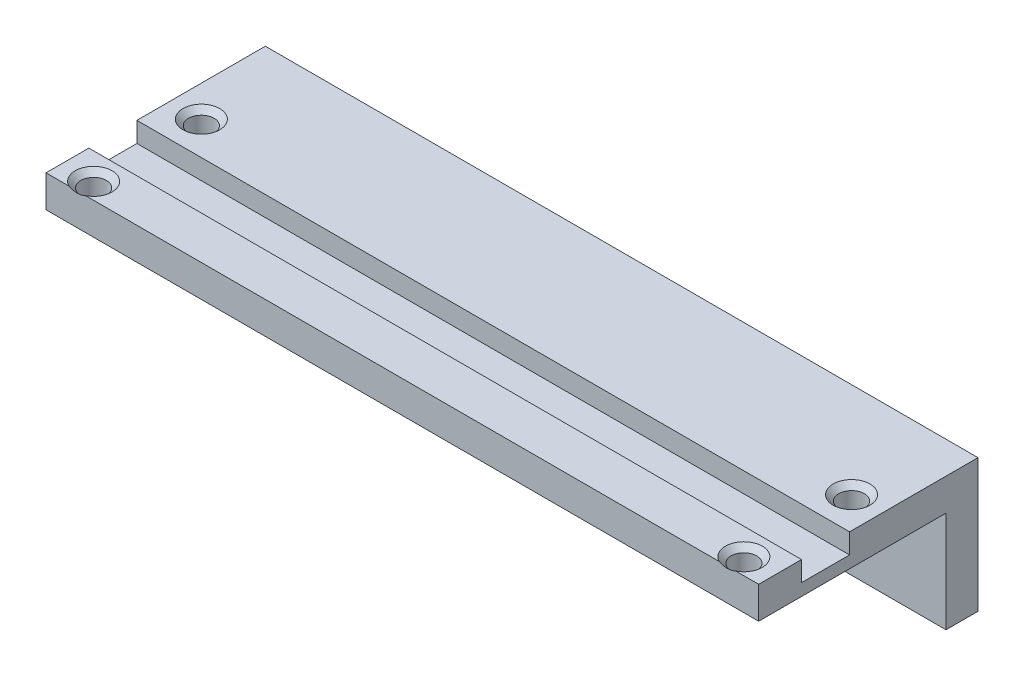
ISO-10303-21;
HEADER;
FILE_DESCRIPTION(('STEP AP214'),'2;1');
FILE_NAME('part.step','',(''),(''),'','','');
FILE_SCHEMA(('AUTOMOTIVE_DESIGN { 1 0 10303 214 1 1 1 1 }'));
ENDSEC;
DATA;
#1=APPLICATION_CONTEXT('core data for automotive mechanical design processes');
#2=APPLICATION_PROTOCOL_DEFINITION('international standard','automotive_design',2000,#1);
#3=PRODUCT_CONTEXT('',#1,'mechanical');
#4=PRODUCT('Part','Part','',(#3));
#5=PRODUCT_RELATED_PRODUCT_CATEGORY('part','',(#4));
#6=PRODUCT_DEFINITION_FORMATION('','',#4);
#7=PRODUCT_DEFINITION_CONTEXT('part definition',#1,'design');
#8=PRODUCT_DEFINITION('design','',#6,#7);
#9=PRODUCT_DEFINITION_SHAPE('','',#8);
#10=(LENGTH_UNIT() NAMED_UNIT(*) SI_UNIT(.MILLI.,.METRE.));
#11=(NAMED_UNIT(*) PLANE_ANGLE_UNIT() SI_UNIT($,.RADIAN.));
#12=(NAMED_UNIT(*) SI_UNIT($,.STERADIAN.) SOLID_ANGLE_UNIT());
#13=UNCERTAINTY_MEASURE_WITH_UNIT(LENGTH_MEASURE(1.E-05),#10,'distance_accuracy_value','');
#14=(GEOMETRIC_REPRESENTATION_CONTEXT(3) GLOBAL_UNCERTAINTY_ASSIGNED_CONTEXT((#13)) GLOBAL_UNIT_ASSIGNED_CONTEXT((#10,
#11,#12)) REPRESENTATION_CONTEXT('',''));
#15=CARTESIAN_POINT('',(0.,0.,0.));
#16=DIRECTION('',(0.,0.,1.));
#17=DIRECTION('',(1.,0.,0.));
#18=AXIS2_PLACEMENT_3D('',#15,#16,#17);
#19=CARTESIAN_POINT('',(0.,0.,0.));
#20=DIRECTION('',(0.,1.,0.));
#21=DIRECTION('',(0.,0.,1.));
#22=AXIS2_PLACEMENT_3D('',#19,#20,#21);
#23=PLANE('',#22);
#24=CARTESIAN_POINT('',(-40.6,0.,9.95));
#25=DIRECTION('',(0.,1.,0.));
#26=DIRECTION('',(0.,0.,1.));
#27=AXIS2_PLACEMENT_3D('',#24,#25,#26);
#28=CIRCLE('',#27,1.6);
#29=CARTESIAN_POINT('',(-40.6,0.,11.55));
#30=VERTEX_POINT('',#29);
#31=EDGE_CURVE('E203',#30,#30,#28,.T.);
#32=ORIENTED_EDGE('',*,*,#31,.T.);
#33=EDGE_LOOP('',(#32));
#34=FACE_BOUND('',#33,.T.);
#35=CARTESIAN_POINT('',(40.6,0.,-3.5));
#36=DIRECTION('',(0.,1.,0.));
#37=DIRECTION('',(0.,0.,1.));
#38=AXIS2_PLACEMENT_3D('',#35,#36,#37);
#39=CIRCLE('',#38,1.6);
#40=CARTESIAN_POINT('',(40.6,0.,-1.9));
#41=VERTEX_POINT('',#40);
#42=EDGE_CURVE('E191',#41,#41,#39,.T.);
#43=ORIENTED_EDGE('',*,*,#42,.T.);
#44=EDGE_LOOP('',(#43));
#45=FACE_BOUND('',#44,.T.);
#46=CARTESIAN_POINT('',(-40.6,0.,-3.5));
#47=DIRECTION('',(0.,1.,0.));
#48=DIRECTION('',(0.,0.,1.));
#49=AXIS2_PLACEMENT_3D('',#46,#47,#48);
#50=CIRCLE('',#49,1.6);
#51=CARTESIAN_POINT('',(-40.6,0.,-1.9));
#52=VERTEX_POINT('',#51);
#53=EDGE_CURVE('E199',#52,#52,#50,.T.);
#54=ORIENTED_EDGE('',*,*,#53,.T.);
#55=EDGE_LOOP('',(#54));
#56=FACE_BOUND('',#55,.T.);
#57=CARTESIAN_POINT('',(40.6,0.,9.95));
#58=DIRECTION('',(0.,1.,0.));
#59=DIRECTION('',(0.,0.,1.));
#60=AXIS2_PLACEMENT_3D('',#57,#58,#59);
#61=CIRCLE('',#60,1.6);
#62=CARTESIAN_POINT('',(40.6,0.,11.55));
#63=VERTEX_POINT('',#62);
#64=EDGE_CURVE('E200',#63,#63,#61,.T.);
#65=ORIENTED_EDGE('',*,*,#64,.T.);
#66=EDGE_LOOP('',(#65));
#67=FACE_BOUND('',#66,.T.);
#68=DIRECTION('',(-1.,0.,0.));
#69=VECTOR('',#68,1.);
#70=CARTESIAN_POINT('',(-44.5,0.,-11.39));
#71=LINE('',#70,#69);
#72=CARTESIAN_POINT('',(44.5,0.,-11.39));
#73=VERTEX_POINT('',#72);
#74=CARTESIAN_POINT('',(-44.5,0.,-11.39));
#75=VERTEX_POINT('',#74);
#76=EDGE_CURVE('E58',#73,#75,#71,.T.);
#77=ORIENTED_EDGE('',*,*,#76,.F.);
#78=DIRECTION('',(0.,0.,-1.));
#79=VECTOR('',#78,1.);
#80=CARTESIAN_POINT('',(44.5,0.,-12.));
#81=LINE('',#80,#79);
#82=CARTESIAN_POINT('',(44.5,0.,12.));
#83=VERTEX_POINT('',#82);
#84=EDGE_CURVE('E208',#83,#73,#81,.T.);
#85=ORIENTED_EDGE('',*,*,#84,.F.);
#86=DIRECTION('',(1.,0.,0.));
#87=VECTOR('',#86,1.);
#88=CARTESIAN_POINT('',(-44.5,0.,12.));
#89=LINE('',#88,#87);
#90=CARTESIAN_POINT('',(-44.5,0.,12.));
#91=VERTEX_POINT('',#90);
#92=EDGE_CURVE('E224',#91,#83,#89,.T.);
#93=ORIENTED_EDGE('',*,*,#92,.F.);
#94=DIRECTION('',(0.,0.,1.));
#95=VECTOR('',#94,1.);
#96=CARTESIAN_POINT('',(-44.5,0.,-12.));
#97=LINE('',#96,#95);
#98=EDGE_CURVE('E222',#75,#91,#97,.T.);
#99=ORIENTED_EDGE('',*,*,#98,.F.);
#100=EDGE_LOOP('',(#77,#85,#93,#99));
#101=FACE_BOUND('',#100,.T.);
#102=ADVANCED_FACE('F41',(#34,#45,#56,#67,#101),#23,.F.);
#103=CARTESIAN_POINT('',(0.,4.,0.));
#104=DIRECTION('',(0.,1.,0.));
#105=DIRECTION('',(0.,0.,1.));
#106=AXIS2_PLACEMENT_3D('',#103,#104,#105);
#107=PLANE('',#106);
#108=CARTESIAN_POINT('',(-40.6,4.,-3.5));
#109=DIRECTION('',(0.,1.,0.));
#110=DIRECTION('',(0.,0.,1.));
#111=AXIS2_PLACEMENT_3D('',#108,#109,#110);
#112=CIRCLE('',#111,2.30000000000001);
#113=CARTESIAN_POINT('',(-40.6,4.,-1.19999999999999));
#114=VERTEX_POINT('',#113);
#115=EDGE_CURVE('E240',#114,#114,#112,.F.);
#116=ORIENTED_EDGE('',*,*,#115,.T.);
#117=EDGE_LOOP('',(#116));
#118=FACE_BOUND('',#117,.T.);
#119=CARTESIAN_POINT('',(40.6,4.,-3.5));
#120=DIRECTION('',(0.,1.,0.));
#121=DIRECTION('',(0.,0.,1.));
#122=AXIS2_PLACEMENT_3D('',#119,#120,#121);
#123=CIRCLE('',#122,2.30000000000001);
#124=CARTESIAN_POINT('',(40.6,4.,-1.19999999999999));
#125=VERTEX_POINT('',#124);
#126=EDGE_CURVE('E237',#125,#125,#123,.F.);
#127=ORIENTED_EDGE('',*,*,#126,.T.);
#128=EDGE_LOOP('',(#127));
#129=FACE_BOUND('',#128,.T.);
#130=DIRECTION('',(0.,0.,1.));
#131=VECTOR('',#130,1.);
#132=CARTESIAN_POINT('',(-44.5,4.,-12.));
#133=LINE('',#132,#131);
#134=CARTESIAN_POINT('',(-44.5,4.,-15.39));
#135=VERTEX_POINT('',#134);
#136=CARTESIAN_POINT('',(-44.5,4.,0.65));
#137=VERTEX_POINT('',#136);
#138=EDGE_CURVE('E142',#135,#137,#133,.T.);
#139=ORIENTED_EDGE('',*,*,#138,.T.);
#140=DIRECTION('',(1.,0.,0.));
#141=VECTOR('',#140,1.);
#142=CARTESIAN_POINT('',(-44.5,4.,0.65));
#143=LINE('',#142,#141);
#144=CARTESIAN_POINT('',(44.5,4.,0.650000000000001));
#145=VERTEX_POINT('',#144);
#146=EDGE_CURVE('E178',#137,#145,#143,.T.);
#147=ORIENTED_EDGE('',*,*,#146,.T.);
#148=DIRECTION('',(0.,0.,-1.));
#149=VECTOR('',#148,1.);
#150=CARTESIAN_POINT('',(44.5,4.,-12.));
#151=LINE('',#150,#149);
#152=CARTESIAN_POINT('',(44.5,4.,-15.39));
#153=VERTEX_POINT('',#152);
#154=EDGE_CURVE('E213',#145,#153,#151,.T.);
#155=ORIENTED_EDGE('',*,*,#154,.T.);
#156=DIRECTION('',(1.,0.,0.));
#157=VECTOR('',#156,1.);
#158=CARTESIAN_POINT('',(44.5,4.,-15.39));
#159=LINE('',#158,#157);
#160=EDGE_CURVE('E146',#135,#153,#159,.T.);
#161=ORIENTED_EDGE('',*,*,#160,.F.);
#162=EDGE_LOOP('',(#139,#147,#155,#161));
#163=FACE_BOUND('',#162,.T.);
#164=ADVANCED_FACE('F273',(#118,#129,#163),#107,.T.);
#165=CARTESIAN_POINT('',(44.5,4.,-12.));
#166=DIRECTION('',(-1.,0.,0.));
#167=DIRECTION('',(0.,0.,1.));
#168=AXIS2_PLACEMENT_3D('',#165,#166,#167);
#169=PLANE('',#168);
#170=DIRECTION('',(0.,0.,1.));
#171=VECTOR('',#170,1.);
#172=CARTESIAN_POINT('',(44.5,1.5,0.65));
#173=LINE('',#172,#171);
#174=CARTESIAN_POINT('',(44.5,1.5,0.65));
#175=VERTEX_POINT('',#174);
#176=CARTESIAN_POINT('',(44.5,1.5,6.65));
#177=VERTEX_POINT('',#176);
#178=EDGE_CURVE('E177',#175,#177,#173,.T.);
#179=ORIENTED_EDGE('',*,*,#178,.T.);
#180=DIRECTION('',(0.,1.,0.));
#181=VECTOR('',#180,1.);
#182=CARTESIAN_POINT('',(44.5,1.5,6.65));
#183=LINE('',#182,#181);
#184=CARTESIAN_POINT('',(44.5,4.,6.65));
#185=VERTEX_POINT('',#184);
#186=EDGE_CURVE('E186',#177,#185,#183,.T.);
#187=ORIENTED_EDGE('',*,*,#186,.T.);
#188=CARTESIAN_POINT('',(44.5,4.,12.));
#189=VERTEX_POINT('',#188);
#190=EDGE_CURVE('E209',#189,#185,#151,.T.);
#191=ORIENTED_EDGE('',*,*,#190,.F.);
#192=DIRECTION('',(0.,-1.,0.));
#193=VECTOR('',#192,1.);
#194=CARTESIAN_POINT('',(44.5,4.,12.));
#195=LINE('',#194,#193);
#196=EDGE_CURVE('E219',#189,#83,#195,.T.);
#197=ORIENTED_EDGE('',*,*,#196,.T.);
#198=ORIENTED_EDGE('',*,*,#84,.T.);
#199=DIRECTION('',(0.,1.,0.));
#200=VECTOR('',#199,1.);
#201=CARTESIAN_POINT('',(44.5,-12.62,-11.39));
#202=LINE('',#201,#200);
#203=CARTESIAN_POINT('',(44.5,-12.62,-11.39));
#204=VERTEX_POINT('',#203);
#205=EDGE_CURVE('E168',#204,#73,#202,.T.);
#206=ORIENTED_EDGE('',*,*,#205,.F.);
#207=DIRECTION('',(0.,0.,1.));
#208=VECTOR('',#207,1.);
#209=CARTESIAN_POINT('',(44.5,-12.62,-15.39));
#210=LINE('',#209,#208);
#211=CARTESIAN_POINT('',(44.5,-12.62,-15.39));
#212=VERTEX_POINT('',#211);
#213=EDGE_CURVE('E155',#212,#204,#210,.T.);
#214=ORIENTED_EDGE('',*,*,#213,.F.);
#215=DIRECTION('',(0.,-1.,0.));
#216=VECTOR('',#215,1.);
#217=CARTESIAN_POINT('',(44.5,4.,-15.39));
#218=LINE('',#217,#216);
#219=EDGE_CURVE('E147',#153,#212,#218,.T.);
#220=ORIENTED_EDGE('',*,*,#219,.F.);
#221=ORIENTED_EDGE('',*,*,#154,.F.);
#222=DIRECTION('',(0.,1.,0.));
#223=VECTOR('',#222,1.);
#224=CARTESIAN_POINT('',(44.5,1.5,0.65));
#225=LINE('',#224,#223);
#226=EDGE_CURVE('E66',#175,#145,#225,.T.);
#227=ORIENTED_EDGE('',*,*,#226,.F.);
#228=EDGE_LOOP('',(#179,#187,#191,#197,#198,#206,#214,#220,#221,#227));
#229=FACE_BOUND('',#228,.T.);
#230=ADVANCED_FACE('F271',(#229),#169,.F.);
#231=CARTESIAN_POINT('',(-44.5,4.,-12.));
#232=DIRECTION('',(1.,0.,0.));
#233=DIRECTION('',(0.,0.,-1.));
#234=AXIS2_PLACEMENT_3D('',#231,#232,#233);
#235=PLANE('',#234);
#236=CARTESIAN_POINT('',(-44.5,4.,6.65));
#237=VERTEX_POINT('',#236);
#238=CARTESIAN_POINT('',(-44.5,4.,12.));
#239=VERTEX_POINT('',#238);
#240=EDGE_CURVE('E212',#237,#239,#133,.T.);
#241=ORIENTED_EDGE('',*,*,#240,.F.);
#242=DIRECTION('',(0.,1.,0.));
#243=VECTOR('',#242,1.);
#244=CARTESIAN_POINT('',(-44.5,1.5,6.65));
#245=LINE('',#244,#243);
#246=CARTESIAN_POINT('',(-44.5,1.5,6.65));
#247=VERTEX_POINT('',#246);
#248=EDGE_CURVE('E189',#247,#237,#245,.T.);
#249=ORIENTED_EDGE('',*,*,#248,.F.);
#250=DIRECTION('',(0.,0.,1.));
#251=VECTOR('',#250,1.);
#252=CARTESIAN_POINT('',(-44.5,1.5,0.65));
#253=LINE('',#252,#251);
#254=CARTESIAN_POINT('',(-44.5,1.5,0.65));
#255=VERTEX_POINT('',#254);
#256=EDGE_CURVE('E183',#255,#247,#253,.T.);
#257=ORIENTED_EDGE('',*,*,#256,.F.);
#258=DIRECTION('',(0.,1.,0.));
#259=VECTOR('',#258,1.);
#260=CARTESIAN_POINT('',(-44.5,1.5,0.65));
#261=LINE('',#260,#259);
#262=EDGE_CURVE('E192',#255,#137,#261,.T.);
#263=ORIENTED_EDGE('',*,*,#262,.T.);
#264=ORIENTED_EDGE('',*,*,#138,.F.);
#265=DIRECTION('',(0.,1.,0.));
#266=VECTOR('',#265,1.);
#267=CARTESIAN_POINT('',(-44.5,4.,-15.39));
#268=LINE('',#267,#266);
#269=CARTESIAN_POINT('',(-44.5,-12.62,-15.39));
#270=VERTEX_POINT('',#269);
#271=EDGE_CURVE('E133',#270,#135,#268,.T.);
#272=ORIENTED_EDGE('',*,*,#271,.F.);
#273=DIRECTION('',(0.,0.,-1.));
#274=VECTOR('',#273,1.);
#275=CARTESIAN_POINT('',(-44.5,-12.62,-15.39));
#276=LINE('',#275,#274);
#277=CARTESIAN_POINT('',(-44.5,-12.62,-11.39));
#278=VERTEX_POINT('',#277);
#279=EDGE_CURVE('E139',#278,#270,#276,.T.);
#280=ORIENTED_EDGE('',*,*,#279,.F.);
#281=DIRECTION('',(0.,1.,0.));
#282=VECTOR('',#281,1.);
#283=CARTESIAN_POINT('',(-44.5,-12.62,-11.39));
#284=LINE('',#283,#282);
#285=EDGE_CURVE('E165',#278,#75,#284,.T.);
#286=ORIENTED_EDGE('',*,*,#285,.T.);
#287=ORIENTED_EDGE('',*,*,#98,.T.);
#288=DIRECTION('',(0.,-1.,0.));
#289=VECTOR('',#288,1.);
#290=CARTESIAN_POINT('',(-44.5,4.,12.));
#291=LINE('',#290,#289);
#292=EDGE_CURVE('E228',#239,#91,#291,.T.);
#293=ORIENTED_EDGE('',*,*,#292,.F.);
#294=EDGE_LOOP('',(#241,#249,#257,#263,#264,#272,#280,#286,#287,#293));
#295=FACE_BOUND('',#294,.T.);
#296=ADVANCED_FACE('F136',(#295),#235,.F.);
#297=CARTESIAN_POINT('',(-44.5,4.,12.));
#298=DIRECTION('',(0.,0.,-1.));
#299=DIRECTION('',(-1.,0.,0.));
#300=AXIS2_PLACEMENT_3D('',#297,#298,#299);
#301=PLANE('',#300);
#302=DIRECTION('',(1.,0.,0.));
#303=VECTOR('',#302,1.);
#304=CARTESIAN_POINT('',(-44.5,4.,12.));
#305=LINE('',#304,#303);
#306=CARTESIAN_POINT('',(-39.5571673192693,4.,12.));
#307=VERTEX_POINT('',#306);
#308=CARTESIAN_POINT('',(39.5571673192693,4.,12.));
#309=VERTEX_POINT('',#308);
#310=EDGE_CURVE('E220',#307,#309,#305,.T.);
#311=ORIENTED_EDGE('',*,*,#310,.F.);
#312=CARTESIAN_POINT('',(-39.5571673192693,4.,12.));
#313=CARTESIAN_POINT('',(-39.6309334262844,3.96656421638273,12.));
#314=CARTESIAN_POINT('',(-39.7058506333684,3.93540373764194,12.));
#315=CARTESIAN_POINT('',(-39.8581858002776,3.87893388207506,12.));
#316=CARTESIAN_POINT('',(-39.9356126452506,3.85364866798946,12.));
#317=CARTESIAN_POINT('',(-40.0915868475527,3.81079265360189,12.));
#318=CARTESIAN_POINT('',(-40.170108112697,3.79312940213403,12.));
#319=CARTESIAN_POINT('',(-40.3285056036563,3.76643099040455,12.));
#320=CARTESIAN_POINT('',(-40.4083793515014,3.75738149064123,12.));
#321=CARTESIAN_POINT('',(-40.5626446604585,3.74900310805638,12.));
#322=CARTESIAN_POINT('',(-40.636999228979,3.74899754413919,12.));
#323=CARTESIAN_POINT('',(-40.7853039115734,3.75702470166128,12.));
#324=CARTESIAN_POINT('',(-40.8592537936944,3.76506162854273,12.));
#325=CARTESIAN_POINT('',(-41.0059345151389,3.78854830585543,12.));
#326=CARTESIAN_POINT('',(-41.0786654240532,3.80399763161277,12.));
#327=CARTESIAN_POINT('',(-41.2224713971537,3.84129414790967,12.));
#328=CARTESIAN_POINT('',(-41.2935458139193,3.86314379612831,12.));
#329=CARTESIAN_POINT('',(-41.4111372203203,3.90419206241791,12.));
#330=CARTESIAN_POINT('',(-41.4581642475137,3.92196371531172,12.));
#331=CARTESIAN_POINT('',(-41.5512063229103,3.95953400303479,12.));
#332=CARTESIAN_POINT('',(-41.5972244138004,3.97932508147157,12.));
#333=CARTESIAN_POINT('',(-41.6428326807308,3.99999999999981,12.));
#334=B_SPLINE_CURVE_WITH_KNOTS('',3,(#312,#313,#314,#315,#316,#317,#318,#319,#320,#321,#322,
#323,#324,#325,#326,#327,#328,#329,#330,#331,#332,#333),.UNSPECIFIED.,.F.,.F.,(4,2,2,2,2,2,2,2,
2,2,4),(0.,0.243096510579763,0.487175756429054,0.728204983271677,0.96883225806452,
1.19145453671029,1.41419328606331,1.63691927570916,1.85973090294407,2.01050258375421,
2.16072946214896),.UNSPECIFIED.);
#335=CARTESIAN_POINT('',(-41.6428326807307,4.,12.));
#336=VERTEX_POINT('',#335);
#337=EDGE_CURVE('E253',#307,#336,#334,.T.);
#338=ORIENTED_EDGE('',*,*,#337,.T.);
#339=EDGE_CURVE('E216',#239,#336,#305,.T.);
#340=ORIENTED_EDGE('',*,*,#339,.F.);
#341=ORIENTED_EDGE('',*,*,#292,.T.);
#342=ORIENTED_EDGE('',*,*,#92,.T.);
#343=ORIENTED_EDGE('',*,*,#196,.F.);
#344=CARTESIAN_POINT('',(41.6428326807307,4.,12.));
#345=VERTEX_POINT('',#344);
#346=EDGE_CURVE('E215',#345,#189,#305,.T.);
#347=ORIENTED_EDGE('',*,*,#346,.F.);
#348=CARTESIAN_POINT('',(41.6428326807307,4.,12.));
#349=CARTESIAN_POINT('',(41.5690665737156,3.96656421638273,12.));
#350=CARTESIAN_POINT('',(41.4941493666316,3.93540373764194,12.));
#351=CARTESIAN_POINT('',(41.3418141997224,3.87893388207506,12.));
#352=CARTESIAN_POINT('',(41.2643873547494,3.85364866798946,12.));
#353=CARTESIAN_POINT('',(41.1084131524472,3.81079265360189,12.));
#354=CARTESIAN_POINT('',(41.029891887303,3.79312940213403,12.));
#355=CARTESIAN_POINT('',(40.8714943963437,3.76643099040455,12.));
#356=CARTESIAN_POINT('',(40.7916206484986,3.75738149064123,12.));
#357=CARTESIAN_POINT('',(40.6373553395415,3.74900310805638,12.));
#358=CARTESIAN_POINT('',(40.563000771021,3.74899754413919,12.));
#359=CARTESIAN_POINT('',(40.4146960884266,3.75702470166128,12.));
#360=CARTESIAN_POINT('',(40.3407462063056,3.76506162854273,12.));
#361=CARTESIAN_POINT('',(40.1940654848611,3.78854830585543,12.));
#362=CARTESIAN_POINT('',(40.1213345759468,3.80399763161277,12.));
#363=CARTESIAN_POINT('',(39.9775286028463,3.84129414790967,12.));
#364=CARTESIAN_POINT('',(39.9064541860807,3.86314379612831,12.));
#365=CARTESIAN_POINT('',(39.7888627796797,3.90419206241791,12.));
#366=CARTESIAN_POINT('',(39.7418357524863,3.92196371531172,12.));
#367=CARTESIAN_POINT('',(39.6487936770897,3.95953400303479,12.));
#368=CARTESIAN_POINT('',(39.6027755861996,3.97932508147157,12.));
#369=CARTESIAN_POINT('',(39.5571673192692,3.99999999999981,12.));
#370=B_SPLINE_CURVE_WITH_KNOTS('',3,(#348,#349,#350,#351,#352,#353,#354,#355,#356,#357,#358,
#359,#360,#361,#362,#363,#364,#365,#366,#367,#368,#369),.UNSPECIFIED.,.F.,.F.,(4,2,2,2,2,2,2,2,
2,2,4),(0.,0.243096510579763,0.487175756429054,0.728204983271698,0.96883225806452,
1.19145453671029,1.41419328606331,1.63691927570916,1.85973090294407,2.01050258375421,
2.16072946214896),.UNSPECIFIED.);
#371=EDGE_CURVE('E246',#345,#309,#370,.T.);
#372=ORIENTED_EDGE('',*,*,#371,.T.);
#373=EDGE_LOOP('',(#311,#338,#340,#341,#342,#343,#347,#372));
#374=FACE_BOUND('',#373,.T.);
#375=ADVANCED_FACE('F260',(#374),#301,.F.);
#376=DIRECTION('',(1.,0.,0.));
#377=VECTOR('',#376,1.);
#378=CARTESIAN_POINT('',(-44.5,4.,6.65));
#379=LINE('',#378,#377);
#380=EDGE_CURVE('E173',#237,#185,#379,.T.);
#381=ORIENTED_EDGE('',*,*,#380,.F.);
#382=ORIENTED_EDGE('',*,*,#240,.T.);
#383=ORIENTED_EDGE('',*,*,#339,.T.);
#384=CARTESIAN_POINT('',(-40.6,4.,9.95));
#385=DIRECTION('',(0.,1.,0.));
#386=DIRECTION('',(0.,0.,1.));
#387=AXIS2_PLACEMENT_3D('',#384,#385,#386);
#388=CIRCLE('',#387,2.30000000000001);
#389=EDGE_CURVE('E243',#336,#307,#388,.F.);
#390=ORIENTED_EDGE('',*,*,#389,.T.);
#391=ORIENTED_EDGE('',*,*,#310,.T.);
#392=CARTESIAN_POINT('',(40.6,4.,9.95));
#393=DIRECTION('',(0.,1.,0.));
#394=DIRECTION('',(0.,0.,1.));
#395=AXIS2_PLACEMENT_3D('',#392,#393,#394);
#396=CIRCLE('',#395,2.30000000000001);
#397=EDGE_CURVE('E234',#309,#345,#396,.F.);
#398=ORIENTED_EDGE('',*,*,#397,.T.);
#399=ORIENTED_EDGE('',*,*,#346,.T.);
#400=ORIENTED_EDGE('',*,*,#190,.T.);
#401=EDGE_LOOP('',(#381,#382,#383,#390,#391,#398,#399,#400));
#402=FACE_BOUND('',#401,.T.);
#403=ADVANCED_FACE('F265',(#402),#107,.T.);
#404=CARTESIAN_POINT('',(-40.6,0.,9.95));
#405=DIRECTION('',(0.,1.,0.));
#406=DIRECTION('',(0.,0.,1.));
#407=AXIS2_PLACEMENT_3D('',#404,#405,#406);
#408=CYLINDRICAL_SURFACE('',#407,1.6);
#409=CARTESIAN_POINT('',(-40.6,3.29999999999999,9.95));
#410=DIRECTION('',(0.,1.,0.));
#411=DIRECTION('',(0.,0.,1.));
#412=AXIS2_PLACEMENT_3D('',#409,#410,#411);
#413=CIRCLE('',#412,1.6);
#414=CARTESIAN_POINT('',(-40.6,3.29999999999999,11.55));
#415=VERTEX_POINT('',#414);
#416=EDGE_CURVE('E231',#415,#415,#413,.T.);
#417=ORIENTED_EDGE('',*,*,#416,.T.);
#418=EDGE_LOOP('',(#417));
#419=FACE_BOUND('',#418,.T.);
#420=ORIENTED_EDGE('',*,*,#31,.F.);
#421=EDGE_LOOP('',(#420));
#422=FACE_BOUND('',#421,.T.);
#423=ADVANCED_FACE('F330',(#419,#422),#408,.F.);
#424=CARTESIAN_POINT('',(40.6,0.,-3.5));
#425=DIRECTION('',(0.,1.,0.));
#426=DIRECTION('',(0.,0.,1.));
#427=AXIS2_PLACEMENT_3D('',#424,#425,#426);
#428=CYLINDRICAL_SURFACE('',#427,1.6);
#429=CARTESIAN_POINT('',(40.6,3.29999999999999,-3.5));
#430=DIRECTION('',(0.,1.,0.));
#431=DIRECTION('',(0.,0.,1.));
#432=AXIS2_PLACEMENT_3D('',#429,#430,#431);
#433=CIRCLE('',#432,1.6);
#434=CARTESIAN_POINT('',(40.6,3.29999999999999,-1.9));
#435=VERTEX_POINT('',#434);
#436=EDGE_CURVE('E51',#435,#435,#433,.T.);
#437=ORIENTED_EDGE('',*,*,#436,.T.);
#438=EDGE_LOOP('',(#437));
#439=FACE_BOUND('',#438,.T.);
#440=ORIENTED_EDGE('',*,*,#42,.F.);
#441=EDGE_LOOP('',(#440));
#442=FACE_BOUND('',#441,.T.);
#443=ADVANCED_FACE('F324',(#439,#442),#428,.F.);
#444=CARTESIAN_POINT('',(-40.6,0.,-3.5));
#445=DIRECTION('',(0.,1.,0.));
#446=DIRECTION('',(0.,0.,1.));
#447=AXIS2_PLACEMENT_3D('',#444,#445,#446);
#448=CYLINDRICAL_SURFACE('',#447,1.6);
#449=CARTESIAN_POINT('',(-40.6,3.29999999999999,-3.5));
#450=DIRECTION('',(0.,1.,0.));
#451=DIRECTION('',(0.,0.,1.));
#452=AXIS2_PLACEMENT_3D('',#449,#450,#451);
#453=CIRCLE('',#452,1.6);
#454=CARTESIAN_POINT('',(-40.6,3.29999999999999,-1.9));
#455=VERTEX_POINT('',#454);
#456=EDGE_CURVE('E350',#455,#455,#453,.T.);
#457=ORIENTED_EDGE('',*,*,#456,.T.);
#458=EDGE_LOOP('',(#457));
#459=FACE_BOUND('',#458,.T.);
#460=ORIENTED_EDGE('',*,*,#53,.F.);
#461=EDGE_LOOP('',(#460));
#462=FACE_BOUND('',#461,.T.);
#463=ADVANCED_FACE('F318',(#459,#462),#448,.F.);
#464=CARTESIAN_POINT('',(40.6,0.,9.95));
#465=DIRECTION('',(0.,1.,0.));
#466=DIRECTION('',(0.,0.,1.));
#467=AXIS2_PLACEMENT_3D('',#464,#465,#466);
#468=CYLINDRICAL_SURFACE('',#467,1.6);
#469=CARTESIAN_POINT('',(40.6,3.29999999999999,9.95));
#470=DIRECTION('',(0.,1.,0.));
#471=DIRECTION('',(0.,0.,1.));
#472=AXIS2_PLACEMENT_3D('',#469,#470,#471);
#473=CIRCLE('',#472,1.6);
#474=CARTESIAN_POINT('',(40.6,3.29999999999999,11.55));
#475=VERTEX_POINT('',#474);
#476=EDGE_CURVE('E11',#475,#475,#473,.T.);
#477=ORIENTED_EDGE('',*,*,#476,.T.);
#478=EDGE_LOOP('',(#477));
#479=FACE_BOUND('',#478,.T.);
#480=ORIENTED_EDGE('',*,*,#64,.F.);
#481=EDGE_LOOP('',(#480));
#482=FACE_BOUND('',#481,.T.);
#483=ADVANCED_FACE('F284',(#479,#482),#468,.F.);
#484=CARTESIAN_POINT('',(-40.6,3.29999999999999,9.95));
#485=DIRECTION('',(0.,1.,0.));
#486=DIRECTION('',(0.,0.,1.));
#487=AXIS2_PLACEMENT_3D('',#484,#485,#486);
#488=CONICAL_SURFACE('',#487,1.6,0.785398163397454);
#489=ORIENTED_EDGE('',*,*,#337,.F.);
#490=ORIENTED_EDGE('',*,*,#389,.F.);
#491=EDGE_LOOP('',(#489,#490));
#492=FACE_BOUND('',#491,.T.);
#493=ORIENTED_EDGE('',*,*,#416,.F.);
#494=EDGE_LOOP('',(#493));
#495=FACE_BOUND('',#494,.T.);
#496=ADVANCED_FACE('F276',(#492,#495),#488,.F.);
#497=CARTESIAN_POINT('',(-40.6,3.29999999999999,-3.5));
#498=DIRECTION('',(0.,1.,0.));
#499=DIRECTION('',(0.,0.,1.));
#500=AXIS2_PLACEMENT_3D('',#497,#498,#499);
#501=CONICAL_SURFACE('',#500,1.6,0.785398163397453);
#502=ORIENTED_EDGE('',*,*,#115,.F.);
#503=EDGE_LOOP('',(#502));
#504=FACE_BOUND('',#503,.T.);
#505=ORIENTED_EDGE('',*,*,#456,.F.);
#506=EDGE_LOOP('',(#505));
#507=FACE_BOUND('',#506,.T.);
#508=ADVANCED_FACE('F283',(#504,#507),#501,.F.);
#509=CARTESIAN_POINT('',(40.6,3.29999999999999,-3.5));
#510=DIRECTION('',(0.,1.,0.));
#511=DIRECTION('',(0.,0.,1.));
#512=AXIS2_PLACEMENT_3D('',#509,#510,#511);
#513=CONICAL_SURFACE('',#512,1.6,0.785398163397453);
#514=ORIENTED_EDGE('',*,*,#126,.F.);
#515=EDGE_LOOP('',(#514));
#516=FACE_BOUND('',#515,.T.);
#517=ORIENTED_EDGE('',*,*,#436,.F.);
#518=EDGE_LOOP('',(#517));
#519=FACE_BOUND('',#518,.T.);
#520=ADVANCED_FACE('F290',(#516,#519),#513,.F.);
#521=CARTESIAN_POINT('',(40.6,3.29999999999999,9.95));
#522=DIRECTION('',(0.,1.,0.));
#523=DIRECTION('',(0.,0.,1.));
#524=AXIS2_PLACEMENT_3D('',#521,#522,#523);
#525=CONICAL_SURFACE('',#524,1.6,0.785398163397454);
#526=ORIENTED_EDGE('',*,*,#371,.F.);
#527=ORIENTED_EDGE('',*,*,#397,.F.);
#528=EDGE_LOOP('',(#526,#527));
#529=FACE_BOUND('',#528,.T.);
#530=ORIENTED_EDGE('',*,*,#476,.F.);
#531=EDGE_LOOP('',(#530));
#532=FACE_BOUND('',#531,.T.);
#533=ADVANCED_FACE('F44',(#529,#532),#525,.F.);
#534=CARTESIAN_POINT('',(-44.5,1.5,6.65));
#535=DIRECTION('',(0.,0.,1.));
#536=DIRECTION('',(1.,0.,0.));
#537=AXIS2_PLACEMENT_3D('',#534,#535,#536);
#538=PLANE('',#537);
#539=ORIENTED_EDGE('',*,*,#380,.T.);
#540=ORIENTED_EDGE('',*,*,#186,.F.);
#541=DIRECTION('',(1.,0.,0.));
#542=VECTOR('',#541,1.);
#543=CARTESIAN_POINT('',(-44.5,1.5,6.65));
#544=LINE('',#543,#542);
#545=EDGE_CURVE('E174',#247,#177,#544,.T.);
#546=ORIENTED_EDGE('',*,*,#545,.F.);
#547=ORIENTED_EDGE('',*,*,#248,.T.);
#548=EDGE_LOOP('',(#539,#540,#546,#547));
#549=FACE_BOUND('',#548,.T.);
#550=ADVANCED_FACE('F299',(#549),#538,.F.);
#551=CARTESIAN_POINT('',(-44.5,1.5,0.65));
#552=DIRECTION('',(0.,0.,1.));
#553=DIRECTION('',(1.,0.,0.));
#554=AXIS2_PLACEMENT_3D('',#551,#552,#553);
#555=PLANE('',#554);
#556=ORIENTED_EDGE('',*,*,#146,.F.);
#557=ORIENTED_EDGE('',*,*,#262,.F.);
#558=DIRECTION('',(1.,0.,0.));
#559=VECTOR('',#558,1.);
#560=CARTESIAN_POINT('',(-44.5,1.5,0.65));
#561=LINE('',#560,#559);
#562=EDGE_CURVE('E181',#255,#175,#561,.T.);
#563=ORIENTED_EDGE('',*,*,#562,.T.);
#564=ORIENTED_EDGE('',*,*,#226,.T.);
#565=EDGE_LOOP('',(#556,#557,#563,#564));
#566=FACE_BOUND('',#565,.T.);
#567=ADVANCED_FACE('F408',(#566),#555,.T.);
#568=CARTESIAN_POINT('',(0.,1.5,0.));
#569=DIRECTION('',(0.,-1.,0.));
#570=DIRECTION('',(0.,0.,-1.));
#571=AXIS2_PLACEMENT_3D('',#568,#569,#570);
#572=PLANE('',#571);
#573=ORIENTED_EDGE('',*,*,#545,.T.);
#574=ORIENTED_EDGE('',*,*,#178,.F.);
#575=ORIENTED_EDGE('',*,*,#562,.F.);
#576=ORIENTED_EDGE('',*,*,#256,.T.);
#577=EDGE_LOOP('',(#573,#574,#575,#576));
#578=FACE_BOUND('',#577,.T.);
#579=ADVANCED_FACE('F416',(#578),#572,.F.);
#580=CARTESIAN_POINT('',(0.,0.,-15.39));
#581=DIRECTION('',(0.,0.,-1.));
#582=DIRECTION('',(-1.,0.,0.));
#583=AXIS2_PLACEMENT_3D('',#580,#581,#582);
#584=PLANE('',#583);
#585=ORIENTED_EDGE('',*,*,#219,.T.);
#586=DIRECTION('',(1.,0.,0.));
#587=VECTOR('',#586,1.);
#588=CARTESIAN_POINT('',(-44.5,-12.62,-15.39));
#589=LINE('',#588,#587);
#590=EDGE_CURVE('E150',#270,#212,#589,.T.);
#591=ORIENTED_EDGE('',*,*,#590,.F.);
#592=ORIENTED_EDGE('',*,*,#271,.T.);
#593=ORIENTED_EDGE('',*,*,#160,.T.);
#594=EDGE_LOOP('',(#585,#591,#592,#593));
#595=FACE_BOUND('',#594,.T.);
#596=ADVANCED_FACE('F151',(#595),#584,.T.);
#597=CARTESIAN_POINT('',(-44.5,-12.62,-11.39));
#598=DIRECTION('',(0.,0.,-1.));
#599=DIRECTION('',(-1.,0.,0.));
#600=AXIS2_PLACEMENT_3D('',#597,#598,#599);
#601=PLANE('',#600);
#602=ORIENTED_EDGE('',*,*,#76,.T.);
#603=ORIENTED_EDGE('',*,*,#285,.F.);
#604=DIRECTION('',(-1.,0.,0.));
#605=VECTOR('',#604,1.);
#606=CARTESIAN_POINT('',(-44.5,-12.62,-11.39));
#607=LINE('',#606,#605);
#608=EDGE_CURVE('E159',#204,#278,#607,.T.);
#609=ORIENTED_EDGE('',*,*,#608,.F.);
#610=ORIENTED_EDGE('',*,*,#205,.T.);
#611=EDGE_LOOP('',(#602,#603,#609,#610));
#612=FACE_BOUND('',#611,.T.);
#613=ADVANCED_FACE('F460',(#612),#601,.F.);
#614=CARTESIAN_POINT('',(0.,-12.62,0.));
#615=DIRECTION('',(0.,1.,0.));
#616=DIRECTION('',(0.,0.,1.));
#617=AXIS2_PLACEMENT_3D('',#614,#615,#616);
#618=PLANE('',#617);
#619=ORIENTED_EDGE('',*,*,#279,.T.);
#620=ORIENTED_EDGE('',*,*,#590,.T.);
#621=ORIENTED_EDGE('',*,*,#213,.T.);
#622=ORIENTED_EDGE('',*,*,#608,.T.);
#623=EDGE_LOOP('',(#619,#620,#621,#622));
#624=FACE_BOUND('',#623,.T.);
#625=ADVANCED_FACE('F157',(#624),#618,.F.);
#626=CLOSED_SHELL('',(#102,#164,#230,#296,#375,#403,#423,#443,#463,#483,#496,#508,#520,#533,
#550,#567,#579,#596,#613,#625));
#627=MANIFOLD_SOLID_BREP('B2',#626);
#628=ADVANCED_BREP_SHAPE_REPRESENTATION('',(#18,#627),#14);
#629=SHAPE_DEFINITION_REPRESENTATION(#9,#628);
ENDSEC;
END-ISO-10303-21;
